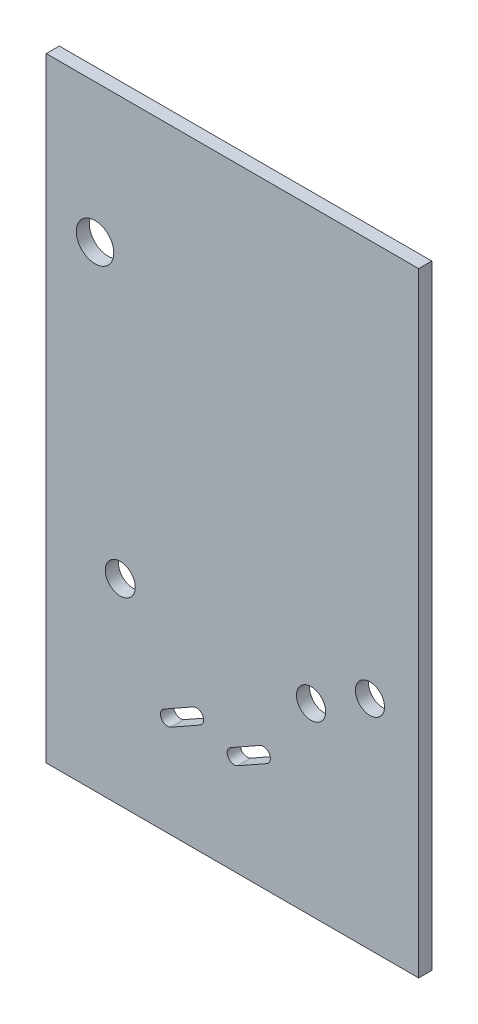
ISO-10303-21;
HEADER;
FILE_DESCRIPTION(('STEP AP214'),'2;1');
FILE_NAME('part.step','',(''),(''),'','','');
FILE_SCHEMA(('AUTOMOTIVE_DESIGN { 1 0 10303 214 1 1 1 1 }'));
ENDSEC;
DATA;
#1=APPLICATION_CONTEXT('core data for automotive mechanical design processes');
#2=APPLICATION_PROTOCOL_DEFINITION('international standard','automotive_design',2000,#1);
#3=PRODUCT_CONTEXT('',#1,'mechanical');
#4=PRODUCT('Part','Part','',(#3));
#5=PRODUCT_RELATED_PRODUCT_CATEGORY('part','',(#4));
#6=PRODUCT_DEFINITION_FORMATION('','',#4);
#7=PRODUCT_DEFINITION_CONTEXT('part definition',#1,'design');
#8=PRODUCT_DEFINITION('design','',#6,#7);
#9=PRODUCT_DEFINITION_SHAPE('','',#8);
#10=(LENGTH_UNIT() NAMED_UNIT(*) SI_UNIT(.MILLI.,.METRE.));
#11=(NAMED_UNIT(*) PLANE_ANGLE_UNIT() SI_UNIT($,.RADIAN.));
#12=(NAMED_UNIT(*) SI_UNIT($,.STERADIAN.) SOLID_ANGLE_UNIT());
#13=UNCERTAINTY_MEASURE_WITH_UNIT(LENGTH_MEASURE(1.E-05),#10,'distance_accuracy_value','');
#14=(GEOMETRIC_REPRESENTATION_CONTEXT(3) GLOBAL_UNCERTAINTY_ASSIGNED_CONTEXT((#13)) GLOBAL_UNIT_ASSIGNED_CONTEXT((#10,
#11,#12)) REPRESENTATION_CONTEXT('',''));
#15=CARTESIAN_POINT('',(0.,0.,0.));
#16=DIRECTION('',(0.,0.,1.));
#17=DIRECTION('',(1.,0.,0.));
#18=AXIS2_PLACEMENT_3D('',#15,#16,#17);
#19=CARTESIAN_POINT('',(-8.60099157288998,-45.8717455575908,3.14));
#20=DIRECTION('',(0.,0.,-1.));
#21=DIRECTION('',(-1.,0.,0.));
#22=AXIS2_PLACEMENT_3D('',#19,#20,#21);
#23=CYLINDRICAL_SURFACE('',#22,1.68807927361543);
#24=CARTESIAN_POINT('',(-8.60099157288998,-45.8717455575908,0.));
#25=DIRECTION('',(0.,0.,1.));
#26=DIRECTION('',(1.,0.,0.));
#27=AXIS2_PLACEMENT_3D('',#24,#25,#26);
#28=CIRCLE('',#27,1.68807927361543);
#29=CARTESIAN_POINT('',(-7.77339173560925,-47.343034157201,0.));
#30=VERTEX_POINT('',#29);
#31=CARTESIAN_POINT('',(-9.42859141017071,-44.4004569579806,0.));
#32=VERTEX_POINT('',#31);
#33=EDGE_CURVE('E197',#30,#32,#28,.T.);
#34=ORIENTED_EDGE('',*,*,#33,.F.);
#35=DIRECTION('',(0.,0.,-1.));
#36=VECTOR('',#35,1.);
#37=CARTESIAN_POINT('',(-7.77339173560925,-47.343034157201,3.14));
#38=LINE('',#37,#36);
#39=CARTESIAN_POINT('',(-7.77339173560925,-47.343034157201,3.14));
#40=VERTEX_POINT('',#39);
#41=EDGE_CURVE('E11',#40,#30,#38,.T.);
#42=ORIENTED_EDGE('',*,*,#41,.F.);
#43=CARTESIAN_POINT('',(-8.60099157288998,-45.8717455575908,3.14));
#44=DIRECTION('',(0.,0.,1.));
#45=DIRECTION('',(1.,0.,0.));
#46=AXIS2_PLACEMENT_3D('',#43,#44,#45);
#47=CIRCLE('',#46,1.68807927361543);
#48=CARTESIAN_POINT('',(-9.42859141017071,-44.4004569579806,3.14));
#49=VERTEX_POINT('',#48);
#50=EDGE_CURVE('E144',#40,#49,#47,.T.);
#51=ORIENTED_EDGE('',*,*,#50,.T.);
#52=DIRECTION('',(0.,0.,-1.));
#53=VECTOR('',#52,1.);
#54=CARTESIAN_POINT('',(-9.42859141017071,-44.4004569579806,3.14));
#55=LINE('',#54,#53);
#56=EDGE_CURVE('E105',#49,#32,#55,.T.);
#57=ORIENTED_EDGE('',*,*,#56,.T.);
#58=EDGE_LOOP('',(#34,#42,#51,#57));
#59=FACE_BOUND('',#58,.T.);
#60=ADVANCED_FACE('F40',(#59),#23,.F.);
#61=CARTESIAN_POINT('',(18.3612824571293,-32.6422799237855,3.14));
#62=DIRECTION('',(0.490261239632559,-0.871575537124549,0.));
#63=DIRECTION('',(0.871575537124549,0.490261239632559,0.));
#64=AXIS2_PLACEMENT_3D('',#61,#62,#63);
#65=PLANE('',#64);
#66=DIRECTION('',(-0.871575537124549,-0.490261239632559,0.));
#67=VECTOR('',#66,1.);
#68=CARTESIAN_POINT('',(18.3612824571293,-32.6422799237855,0.));
#69=LINE('',#68,#67);
#70=CARTESIAN_POINT('',(-14.7459960326056,-51.2651240742614,0.));
#71=VERTEX_POINT('',#70);
#72=EDGE_CURVE('E150',#30,#71,#69,.T.);
#73=ORIENTED_EDGE('',*,*,#72,.T.);
#74=DIRECTION('',(0.,0.,-1.));
#75=VECTOR('',#74,1.);
#76=CARTESIAN_POINT('',(-14.7459960326056,-51.2651240742614,3.14));
#77=LINE('',#76,#75);
#78=CARTESIAN_POINT('',(-14.7459960326056,-51.2651240742614,3.14));
#79=VERTEX_POINT('',#78);
#80=EDGE_CURVE('E50',#79,#71,#77,.T.);
#81=ORIENTED_EDGE('',*,*,#80,.F.);
#82=DIRECTION('',(-0.871575537124549,-0.490261239632559,0.));
#83=VECTOR('',#82,1.);
#84=CARTESIAN_POINT('',(18.3612824571293,-32.6422799237855,3.14));
#85=LINE('',#84,#83);
#86=EDGE_CURVE('E138',#40,#79,#85,.T.);
#87=ORIENTED_EDGE('',*,*,#86,.F.);
#88=ORIENTED_EDGE('',*,*,#41,.T.);
#89=EDGE_LOOP('',(#73,#81,#87,#88));
#90=FACE_BOUND('',#89,.T.);
#91=ADVANCED_FACE('F148',(#90),#65,.F.);
#92=CARTESIAN_POINT('',(-15.5735958698864,-49.7938354746512,3.14));
#93=DIRECTION('',(0.,0.,-1.));
#94=DIRECTION('',(-1.,0.,0.));
#95=AXIS2_PLACEMENT_3D('',#92,#93,#94);
#96=CYLINDRICAL_SURFACE('',#95,1.68807927361543);
#97=CARTESIAN_POINT('',(-15.5735958698864,-49.7938354746512,0.));
#98=DIRECTION('',(0.,0.,1.));
#99=DIRECTION('',(1.,0.,0.));
#100=AXIS2_PLACEMENT_3D('',#97,#98,#99);
#101=CIRCLE('',#100,1.68807927361543);
#102=CARTESIAN_POINT('',(-16.4011957071671,-48.322546875041,0.));
#103=VERTEX_POINT('',#102);
#104=EDGE_CURVE('E201',#103,#71,#101,.T.);
#105=ORIENTED_EDGE('',*,*,#104,.F.);
#106=DIRECTION('',(0.,0.,-1.));
#107=VECTOR('',#106,1.);
#108=CARTESIAN_POINT('',(-16.4011957071671,-48.322546875041,3.14));
#109=LINE('',#108,#107);
#110=CARTESIAN_POINT('',(-16.4011957071671,-48.322546875041,3.14));
#111=VERTEX_POINT('',#110);
#112=EDGE_CURVE('E98',#111,#103,#109,.T.);
#113=ORIENTED_EDGE('',*,*,#112,.F.);
#114=CARTESIAN_POINT('',(-15.5735958698864,-49.7938354746512,3.14));
#115=DIRECTION('',(0.,0.,1.));
#116=DIRECTION('',(1.,0.,0.));
#117=AXIS2_PLACEMENT_3D('',#114,#115,#116);
#118=CIRCLE('',#117,1.68807927361543);
#119=EDGE_CURVE('E143',#111,#79,#118,.T.);
#120=ORIENTED_EDGE('',*,*,#119,.T.);
#121=ORIENTED_EDGE('',*,*,#80,.T.);
#122=EDGE_LOOP('',(#105,#113,#120,#121));
#123=FACE_BOUND('',#122,.T.);
#124=ADVANCED_FACE('F155',(#123),#96,.F.);
#125=CARTESIAN_POINT('',(0.426404130113626,-49.7938354746512,3.14));
#126=DIRECTION('',(0.,0.,-1.));
#127=DIRECTION('',(-1.,0.,0.));
#128=AXIS2_PLACEMENT_3D('',#125,#126,#127);
#129=CYLINDRICAL_SURFACE('',#128,1.68807927361543);
#130=CARTESIAN_POINT('',(0.426404130113626,-49.7938354746512,0.));
#131=DIRECTION('',(0.,0.,1.));
#132=DIRECTION('',(1.,0.,0.));
#133=AXIS2_PLACEMENT_3D('',#130,#131,#132);
#134=CIRCLE('',#133,1.68807927361543);
#135=CARTESIAN_POINT('',(-0.401195707167103,-48.322546875041,0.));
#136=VERTEX_POINT('',#135);
#137=CARTESIAN_POINT('',(1.25400396739436,-51.2651240742614,0.));
#138=VERTEX_POINT('',#137);
#139=EDGE_CURVE('E179',#136,#138,#134,.T.);
#140=ORIENTED_EDGE('',*,*,#139,.F.);
#141=DIRECTION('',(0.,0.,-1.));
#142=VECTOR('',#141,1.);
#143=CARTESIAN_POINT('',(-0.401195707167103,-48.322546875041,3.14));
#144=LINE('',#143,#142);
#145=CARTESIAN_POINT('',(-0.401195707167103,-48.322546875041,3.14));
#146=VERTEX_POINT('',#145);
#147=EDGE_CURVE('E210',#146,#136,#144,.T.);
#148=ORIENTED_EDGE('',*,*,#147,.F.);
#149=CARTESIAN_POINT('',(0.426404130113626,-49.7938354746512,3.14));
#150=DIRECTION('',(0.,0.,1.));
#151=DIRECTION('',(1.,0.,0.));
#152=AXIS2_PLACEMENT_3D('',#149,#150,#151);
#153=CIRCLE('',#152,1.68807927361543);
#154=CARTESIAN_POINT('',(1.25400396739436,-51.2651240742614,3.14));
#155=VERTEX_POINT('',#154);
#156=EDGE_CURVE('E249',#146,#155,#153,.T.);
#157=ORIENTED_EDGE('',*,*,#156,.T.);
#158=DIRECTION('',(0.,0.,-1.));
#159=VECTOR('',#158,1.);
#160=CARTESIAN_POINT('',(1.25400396739436,-51.2651240742614,3.14));
#161=LINE('',#160,#159);
#162=EDGE_CURVE('E212',#155,#138,#161,.T.);
#163=ORIENTED_EDGE('',*,*,#162,.T.);
#164=EDGE_LOOP('',(#140,#148,#157,#163));
#165=FACE_BOUND('',#164,.T.);
#166=ADVANCED_FACE('F305',(#165),#129,.F.);
#167=CARTESIAN_POINT('',(20.5517801119447,-36.5364979767907,3.14));
#168=DIRECTION('',(-0.490261239632559,0.871575537124549,0.));
#169=DIRECTION('',(-0.871575537124549,-0.490261239632559,0.));
#170=AXIS2_PLACEMENT_3D('',#167,#168,#169);
#171=PLANE('',#170);
#172=DIRECTION('',(0.871575537124549,0.490261239632559,0.));
#173=VECTOR('',#172,1.);
#174=CARTESIAN_POINT('',(20.5517801119447,-36.5364979767907,0.));
#175=LINE('',#174,#173);
#176=CARTESIAN_POINT('',(6.57140858982929,-44.4004569579806,0.));
#177=VERTEX_POINT('',#176);
#178=EDGE_CURVE('E182',#136,#177,#175,.T.);
#179=ORIENTED_EDGE('',*,*,#178,.T.);
#180=DIRECTION('',(0.,0.,-1.));
#181=VECTOR('',#180,1.);
#182=CARTESIAN_POINT('',(6.57140858982929,-44.4004569579806,3.14));
#183=LINE('',#182,#181);
#184=CARTESIAN_POINT('',(6.57140858982929,-44.4004569579806,3.14));
#185=VERTEX_POINT('',#184);
#186=EDGE_CURVE('E216',#185,#177,#183,.T.);
#187=ORIENTED_EDGE('',*,*,#186,.F.);
#188=DIRECTION('',(0.871575537124549,0.490261239632559,0.));
#189=VECTOR('',#188,1.);
#190=CARTESIAN_POINT('',(20.5517801119447,-36.5364979767907,3.14));
#191=LINE('',#190,#189);
#192=EDGE_CURVE('E255',#146,#185,#191,.T.);
#193=ORIENTED_EDGE('',*,*,#192,.F.);
#194=ORIENTED_EDGE('',*,*,#147,.T.);
#195=EDGE_LOOP('',(#179,#187,#193,#194));
#196=FACE_BOUND('',#195,.T.);
#197=ADVANCED_FACE('F301',(#196),#171,.F.);
#198=CARTESIAN_POINT('',(7.39900842711002,-45.8717455575908,3.14));
#199=DIRECTION('',(0.,0.,-1.));
#200=DIRECTION('',(-1.,0.,0.));
#201=AXIS2_PLACEMENT_3D('',#198,#199,#200);
#202=CYLINDRICAL_SURFACE('',#201,1.68807927361543);
#203=CARTESIAN_POINT('',(7.39900842711002,-45.8717455575908,0.));
#204=DIRECTION('',(0.,0.,1.));
#205=DIRECTION('',(1.,0.,0.));
#206=AXIS2_PLACEMENT_3D('',#203,#204,#205);
#207=CIRCLE('',#206,1.68807927361543);
#208=CARTESIAN_POINT('',(8.22660826439075,-47.343034157201,0.));
#209=VERTEX_POINT('',#208);
#210=EDGE_CURVE('E185',#209,#177,#207,.T.);
#211=ORIENTED_EDGE('',*,*,#210,.F.);
#212=DIRECTION('',(0.,0.,-1.));
#213=VECTOR('',#212,1.);
#214=CARTESIAN_POINT('',(8.22660826439075,-47.343034157201,3.14));
#215=LINE('',#214,#213);
#216=CARTESIAN_POINT('',(8.22660826439075,-47.343034157201,3.14));
#217=VERTEX_POINT('',#216);
#218=EDGE_CURVE('E214',#217,#209,#215,.T.);
#219=ORIENTED_EDGE('',*,*,#218,.F.);
#220=CARTESIAN_POINT('',(7.39900842711002,-45.8717455575908,3.14));
#221=DIRECTION('',(0.,0.,1.));
#222=DIRECTION('',(1.,0.,0.));
#223=AXIS2_PLACEMENT_3D('',#220,#221,#222);
#224=CIRCLE('',#223,1.68807927361543);
#225=EDGE_CURVE('E257',#217,#185,#224,.T.);
#226=ORIENTED_EDGE('',*,*,#225,.T.);
#227=ORIENTED_EDGE('',*,*,#186,.T.);
#228=EDGE_LOOP('',(#211,#219,#226,#227));
#229=FACE_BOUND('',#228,.T.);
#230=ADVANCED_FACE('F298',(#229),#202,.F.);
#231=CARTESIAN_POINT('',(0.,-73.6471361532433,3.14));
#232=DIRECTION('',(0.,-1.,0.));
#233=DIRECTION('',(0.,0.,-1.));
#234=AXIS2_PLACEMENT_3D('',#231,#232,#233);
#235=PLANE('',#234);
#236=DIRECTION('',(-1.,0.,0.));
#237=VECTOR('',#236,1.);
#238=CARTESIAN_POINT('',(0.,-73.6471361532433,0.));
#239=LINE('',#238,#237);
#240=CARTESIAN_POINT('',(44.6471361532433,-73.6471361532433,0.));
#241=VERTEX_POINT('',#240);
#242=CARTESIAN_POINT('',(-44.6471361532433,-73.6471361532433,0.));
#243=VERTEX_POINT('',#242);
#244=EDGE_CURVE('E164',#241,#243,#239,.T.);
#245=ORIENTED_EDGE('',*,*,#244,.F.);
#246=DIRECTION('',(0.,0.,-1.));
#247=VECTOR('',#246,1.);
#248=CARTESIAN_POINT('',(44.6471361532433,-73.6471361532433,3.14));
#249=LINE('',#248,#247);
#250=CARTESIAN_POINT('',(44.6471361532433,-73.6471361532433,3.14));
#251=VERTEX_POINT('',#250);
#252=EDGE_CURVE('E44',#251,#241,#249,.T.);
#253=ORIENTED_EDGE('',*,*,#252,.F.);
#254=DIRECTION('',(-1.,0.,0.));
#255=VECTOR('',#254,1.);
#256=CARTESIAN_POINT('',(0.,-73.6471361532433,3.14));
#257=LINE('',#256,#255);
#258=CARTESIAN_POINT('',(-44.6471361532433,-73.6471361532433,3.14));
#259=VERTEX_POINT('',#258);
#260=EDGE_CURVE('E208',#251,#259,#257,.T.);
#261=ORIENTED_EDGE('',*,*,#260,.T.);
#262=DIRECTION('',(0.,0.,-1.));
#263=VECTOR('',#262,1.);
#264=CARTESIAN_POINT('',(-44.6471361532433,-73.6471361532433,3.14));
#265=LINE('',#264,#263);
#266=EDGE_CURVE('E163',#259,#243,#265,.T.);
#267=ORIENTED_EDGE('',*,*,#266,.T.);
#268=EDGE_LOOP('',(#245,#253,#261,#267));
#269=FACE_BOUND('',#268,.T.);
#270=ADVANCED_FACE('F42',(#269),#235,.T.);
#271=CARTESIAN_POINT('',(44.6471361532433,0.,3.14));
#272=DIRECTION('',(1.,0.,0.));
#273=DIRECTION('',(0.,0.,-1.));
#274=AXIS2_PLACEMENT_3D('',#271,#272,#273);
#275=PLANE('',#274);
#276=DIRECTION('',(0.,-1.,0.));
#277=VECTOR('',#276,1.);
#278=CARTESIAN_POINT('',(44.6471361532433,0.,0.));
#279=LINE('',#278,#277);
#280=CARTESIAN_POINT('',(44.6471361532433,73.6471361532433,0.));
#281=VERTEX_POINT('',#280);
#282=EDGE_CURVE('E167',#281,#241,#279,.T.);
#283=ORIENTED_EDGE('',*,*,#282,.F.);
#284=DIRECTION('',(0.,0.,-1.));
#285=VECTOR('',#284,1.);
#286=CARTESIAN_POINT('',(44.6471361532433,73.6471361532433,3.14));
#287=LINE('',#286,#285);
#288=CARTESIAN_POINT('',(44.6471361532433,73.6471361532433,3.14));
#289=VERTEX_POINT('',#288);
#290=EDGE_CURVE('E221',#289,#281,#287,.T.);
#291=ORIENTED_EDGE('',*,*,#290,.F.);
#292=DIRECTION('',(0.,-1.,0.));
#293=VECTOR('',#292,1.);
#294=CARTESIAN_POINT('',(44.6471361532433,0.,3.14));
#295=LINE('',#294,#293);
#296=EDGE_CURVE('E230',#289,#251,#295,.T.);
#297=ORIENTED_EDGE('',*,*,#296,.T.);
#298=ORIENTED_EDGE('',*,*,#252,.T.);
#299=EDGE_LOOP('',(#283,#291,#297,#298));
#300=FACE_BOUND('',#299,.T.);
#301=ADVANCED_FACE('F228',(#300),#275,.T.);
#302=CARTESIAN_POINT('',(0.,73.6471361532433,3.14));
#303=DIRECTION('',(0.,1.,0.));
#304=DIRECTION('',(0.,0.,1.));
#305=AXIS2_PLACEMENT_3D('',#302,#303,#304);
#306=PLANE('',#305);
#307=DIRECTION('',(1.,0.,0.));
#308=VECTOR('',#307,1.);
#309=CARTESIAN_POINT('',(0.,73.6471361532433,0.));
#310=LINE('',#309,#308);
#311=CARTESIAN_POINT('',(-44.6471361532433,73.6471361532433,0.));
#312=VERTEX_POINT('',#311);
#313=EDGE_CURVE('E170',#312,#281,#310,.T.);
#314=ORIENTED_EDGE('',*,*,#313,.F.);
#315=DIRECTION('',(0.,0.,-1.));
#316=VECTOR('',#315,1.);
#317=CARTESIAN_POINT('',(-44.6471361532433,73.6471361532433,3.14));
#318=LINE('',#317,#316);
#319=CARTESIAN_POINT('',(-44.6471361532433,73.6471361532433,3.14));
#320=VERTEX_POINT('',#319);
#321=EDGE_CURVE('E220',#320,#312,#318,.T.);
#322=ORIENTED_EDGE('',*,*,#321,.F.);
#323=DIRECTION('',(1.,0.,0.));
#324=VECTOR('',#323,1.);
#325=CARTESIAN_POINT('',(0.,73.6471361532433,3.14));
#326=LINE('',#325,#324);
#327=EDGE_CURVE('E237',#320,#289,#326,.T.);
#328=ORIENTED_EDGE('',*,*,#327,.T.);
#329=ORIENTED_EDGE('',*,*,#290,.T.);
#330=EDGE_LOOP('',(#314,#322,#328,#329));
#331=FACE_BOUND('',#330,.T.);
#332=ADVANCED_FACE('F235',(#331),#306,.T.);
#333=CARTESIAN_POINT('',(16.7060827825679,-29.6997027245651,3.14));
#334=DIRECTION('',(-0.490261239632559,0.871575537124549,0.));
#335=DIRECTION('',(-0.871575537124549,-0.490261239632559,0.));
#336=AXIS2_PLACEMENT_3D('',#333,#334,#335);
#337=PLANE('',#336);
#338=DIRECTION('',(0.871575537124549,0.490261239632559,0.));
#339=VECTOR('',#338,1.);
#340=CARTESIAN_POINT('',(16.7060827825679,-29.6997027245651,0.));
#341=LINE('',#340,#339);
#342=EDGE_CURVE('E203',#103,#32,#341,.T.);
#343=ORIENTED_EDGE('',*,*,#342,.T.);
#344=ORIENTED_EDGE('',*,*,#56,.F.);
#345=DIRECTION('',(0.871575537124549,0.490261239632559,0.));
#346=VECTOR('',#345,1.);
#347=CARTESIAN_POINT('',(16.7060827825679,-29.6997027245651,3.14));
#348=LINE('',#347,#346);
#349=EDGE_CURVE('E59',#111,#49,#348,.T.);
#350=ORIENTED_EDGE('',*,*,#349,.F.);
#351=ORIENTED_EDGE('',*,*,#112,.T.);
#352=EDGE_LOOP('',(#343,#344,#350,#351));
#353=FACE_BOUND('',#352,.T.);
#354=ADVANCED_FACE('F269',(#353),#337,.F.);
#355=CARTESIAN_POINT('',(18.8494942682823,-29.546234455101,3.14));
#356=DIRECTION('',(0.,0.,-1.));
#357=DIRECTION('',(-1.,0.,0.));
#358=AXIS2_PLACEMENT_3D('',#355,#356,#357);
#359=CYLINDRICAL_SURFACE('',#358,3.5);
#360=CARTESIAN_POINT('',(18.8494942682823,-29.546234455101,3.14));
#361=DIRECTION('',(0.,0.,1.));
#362=DIRECTION('',(1.,0.,0.));
#363=AXIS2_PLACEMENT_3D('',#360,#361,#362);
#364=CIRCLE('',#363,3.5);
#365=CARTESIAN_POINT('',(22.3494942682823,-29.546234455101,3.14));
#366=VERTEX_POINT('',#365);
#367=EDGE_CURVE('E265',#366,#366,#364,.T.);
#368=ORIENTED_EDGE('',*,*,#367,.T.);
#369=EDGE_LOOP('',(#368));
#370=FACE_BOUND('',#369,.T.);
#371=CARTESIAN_POINT('',(18.8494942682823,-29.546234455101,0.));
#372=DIRECTION('',(0.,0.,1.));
#373=DIRECTION('',(1.,0.,0.));
#374=AXIS2_PLACEMENT_3D('',#371,#372,#373);
#375=CIRCLE('',#374,3.5);
#376=CARTESIAN_POINT('',(22.3494942682823,-29.546234455101,0.));
#377=VERTEX_POINT('',#376);
#378=EDGE_CURVE('E194',#377,#377,#375,.T.);
#379=ORIENTED_EDGE('',*,*,#378,.F.);
#380=EDGE_LOOP('',(#379));
#381=FACE_BOUND('',#380,.T.);
#382=ADVANCED_FACE('F271',(#370,#381),#359,.F.);
#383=CARTESIAN_POINT('',(32.9602390001932,-21.4766523115394,3.14));
#384=DIRECTION('',(0.,0.,-1.));
#385=DIRECTION('',(-1.,0.,0.));
#386=AXIS2_PLACEMENT_3D('',#383,#384,#385);
#387=CYLINDRICAL_SURFACE('',#386,3.5);
#388=CARTESIAN_POINT('',(32.9602390001932,-21.4766523115394,3.14));
#389=DIRECTION('',(0.,0.,1.));
#390=DIRECTION('',(1.,0.,0.));
#391=AXIS2_PLACEMENT_3D('',#388,#389,#390);
#392=CIRCLE('',#391,3.5);
#393=CARTESIAN_POINT('',(36.4602390001932,-21.4766523115394,3.14));
#394=VERTEX_POINT('',#393);
#395=EDGE_CURVE('E262',#394,#394,#392,.T.);
#396=ORIENTED_EDGE('',*,*,#395,.T.);
#397=EDGE_LOOP('',(#396));
#398=FACE_BOUND('',#397,.T.);
#399=CARTESIAN_POINT('',(32.9602390001932,-21.4766523115394,0.));
#400=DIRECTION('',(0.,0.,1.));
#401=DIRECTION('',(1.,0.,0.));
#402=AXIS2_PLACEMENT_3D('',#399,#400,#401);
#403=CIRCLE('',#402,3.5);
#404=CARTESIAN_POINT('',(36.4602390001932,-21.4766523115394,0.));
#405=VERTEX_POINT('',#404);
#406=EDGE_CURVE('E191',#405,#405,#403,.T.);
#407=ORIENTED_EDGE('',*,*,#406,.F.);
#408=EDGE_LOOP('',(#407));
#409=FACE_BOUND('',#408,.T.);
#410=ADVANCED_FACE('F277',(#398,#409),#387,.F.);
#411=CARTESIAN_POINT('',(22.2069797865062,-39.479075176011,3.14));
#412=DIRECTION('',(0.490261239632559,-0.871575537124549,0.));
#413=DIRECTION('',(0.871575537124549,0.490261239632559,0.));
#414=AXIS2_PLACEMENT_3D('',#411,#412,#413);
#415=PLANE('',#414);
#416=DIRECTION('',(-0.871575537124549,-0.490261239632559,0.));
#417=VECTOR('',#416,1.);
#418=CARTESIAN_POINT('',(22.2069797865062,-39.479075176011,0.));
#419=LINE('',#418,#417);
#420=EDGE_CURVE('E188',#209,#138,#419,.T.);
#421=ORIENTED_EDGE('',*,*,#420,.T.);
#422=ORIENTED_EDGE('',*,*,#162,.F.);
#423=DIRECTION('',(-0.871575537124549,-0.490261239632559,0.));
#424=VECTOR('',#423,1.);
#425=CARTESIAN_POINT('',(22.2069797865062,-39.479075176011,3.14));
#426=LINE('',#425,#424);
#427=EDGE_CURVE('E260',#217,#155,#426,.T.);
#428=ORIENTED_EDGE('',*,*,#427,.F.);
#429=ORIENTED_EDGE('',*,*,#218,.T.);
#430=EDGE_LOOP('',(#421,#422,#428,#429));
#431=FACE_BOUND('',#430,.T.);
#432=ADVANCED_FACE('F292',(#431),#415,.F.);
#433=CARTESIAN_POINT('',(-32.9539321976683,40.3410634247451,3.14));
#434=DIRECTION('',(0.,0.,-1.));
#435=DIRECTION('',(-1.,0.,0.));
#436=AXIS2_PLACEMENT_3D('',#433,#434,#435);
#437=CYLINDRICAL_SURFACE('',#436,4.5);
#438=CARTESIAN_POINT('',(-32.9539321976683,40.3410634247451,3.14));
#439=DIRECTION('',(0.,0.,1.));
#440=DIRECTION('',(1.,0.,0.));
#441=AXIS2_PLACEMENT_3D('',#438,#439,#440);
#442=CIRCLE('',#441,4.5);
#443=CARTESIAN_POINT('',(-28.4539321976683,40.3410634247451,3.14));
#444=VERTEX_POINT('',#443);
#445=EDGE_CURVE('E246',#444,#444,#442,.T.);
#446=ORIENTED_EDGE('',*,*,#445,.T.);
#447=EDGE_LOOP('',(#446));
#448=FACE_BOUND('',#447,.T.);
#449=CARTESIAN_POINT('',(-32.9539321976683,40.3410634247451,0.));
#450=DIRECTION('',(0.,0.,1.));
#451=DIRECTION('',(1.,0.,0.));
#452=AXIS2_PLACEMENT_3D('',#449,#450,#451);
#453=CIRCLE('',#452,4.5);
#454=CARTESIAN_POINT('',(-28.4539321976683,40.3410634247451,0.));
#455=VERTEX_POINT('',#454);
#456=EDGE_CURVE('E176',#455,#455,#453,.T.);
#457=ORIENTED_EDGE('',*,*,#456,.F.);
#458=EDGE_LOOP('',(#457));
#459=FACE_BOUND('',#458,.T.);
#460=ADVANCED_FACE('F296',(#448,#459),#437,.F.);
#461=CARTESIAN_POINT('',(-44.6471361532433,0.,3.14));
#462=DIRECTION('',(-1.,0.,0.));
#463=DIRECTION('',(0.,0.,1.));
#464=AXIS2_PLACEMENT_3D('',#461,#462,#463);
#465=PLANE('',#464);
#466=DIRECTION('',(0.,1.,0.));
#467=VECTOR('',#466,1.);
#468=CARTESIAN_POINT('',(-44.6471361532433,0.,0.));
#469=LINE('',#468,#467);
#470=EDGE_CURVE('E173',#243,#312,#469,.T.);
#471=ORIENTED_EDGE('',*,*,#470,.F.);
#472=ORIENTED_EDGE('',*,*,#266,.F.);
#473=DIRECTION('',(0.,1.,0.));
#474=VECTOR('',#473,1.);
#475=CARTESIAN_POINT('',(-44.6471361532433,0.,3.14));
#476=LINE('',#475,#474);
#477=EDGE_CURVE('E243',#259,#320,#476,.T.);
#478=ORIENTED_EDGE('',*,*,#477,.T.);
#479=ORIENTED_EDGE('',*,*,#321,.T.);
#480=EDGE_LOOP('',(#471,#472,#478,#479));
#481=FACE_BOUND('',#480,.T.);
#482=ADVANCED_FACE('F245',(#481),#465,.T.);
#483=CARTESIAN_POINT('',(-26.9008312163464,-26.5172025656939,3.14));
#484=DIRECTION('',(0.,0.,-1.));
#485=DIRECTION('',(-1.,0.,0.));
#486=AXIS2_PLACEMENT_3D('',#483,#484,#485);
#487=CYLINDRICAL_SURFACE('',#486,3.6);
#488=CARTESIAN_POINT('',(-26.9008312163464,-26.5172025656939,3.14));
#489=DIRECTION('',(0.,0.,1.));
#490=DIRECTION('',(1.,0.,0.));
#491=AXIS2_PLACEMENT_3D('',#488,#489,#490);
#492=CIRCLE('',#491,3.6);
#493=CARTESIAN_POINT('',(-23.3008312163464,-26.5172025656939,3.14));
#494=VERTEX_POINT('',#493);
#495=EDGE_CURVE('E157',#494,#494,#492,.T.);
#496=ORIENTED_EDGE('',*,*,#495,.T.);
#497=EDGE_LOOP('',(#496));
#498=FACE_BOUND('',#497,.T.);
#499=CARTESIAN_POINT('',(-26.9008312163464,-26.5172025656939,0.));
#500=DIRECTION('',(0.,0.,1.));
#501=DIRECTION('',(1.,0.,0.));
#502=AXIS2_PLACEMENT_3D('',#499,#500,#501);
#503=CIRCLE('',#502,3.6);
#504=CARTESIAN_POINT('',(-23.3008312163464,-26.5172025656939,0.));
#505=VERTEX_POINT('',#504);
#506=EDGE_CURVE('E205',#505,#505,#503,.T.);
#507=ORIENTED_EDGE('',*,*,#506,.F.);
#508=EDGE_LOOP('',(#507));
#509=FACE_BOUND('',#508,.T.);
#510=ADVANCED_FACE('F314',(#498,#509),#487,.F.);
#511=CARTESIAN_POINT('',(0.,0.,3.14));
#512=DIRECTION('',(0.,0.,1.));
#513=DIRECTION('',(1.,0.,0.));
#514=AXIS2_PLACEMENT_3D('',#511,#512,#513);
#515=PLANE('',#514);
#516=ORIENTED_EDGE('',*,*,#260,.F.);
#517=ORIENTED_EDGE('',*,*,#296,.F.);
#518=ORIENTED_EDGE('',*,*,#327,.F.);
#519=ORIENTED_EDGE('',*,*,#477,.F.);
#520=EDGE_LOOP('',(#516,#517,#518,#519));
#521=FACE_BOUND('',#520,.T.);
#522=ORIENTED_EDGE('',*,*,#445,.F.);
#523=EDGE_LOOP('',(#522));
#524=FACE_BOUND('',#523,.T.);
#525=ORIENTED_EDGE('',*,*,#156,.F.);
#526=ORIENTED_EDGE('',*,*,#192,.T.);
#527=ORIENTED_EDGE('',*,*,#225,.F.);
#528=ORIENTED_EDGE('',*,*,#427,.T.);
#529=EDGE_LOOP('',(#525,#526,#527,#528));
#530=FACE_BOUND('',#529,.T.);
#531=ORIENTED_EDGE('',*,*,#395,.F.);
#532=EDGE_LOOP('',(#531));
#533=FACE_BOUND('',#532,.T.);
#534=ORIENTED_EDGE('',*,*,#367,.F.);
#535=EDGE_LOOP('',(#534));
#536=FACE_BOUND('',#535,.T.);
#537=ORIENTED_EDGE('',*,*,#50,.F.);
#538=ORIENTED_EDGE('',*,*,#86,.T.);
#539=ORIENTED_EDGE('',*,*,#119,.F.);
#540=ORIENTED_EDGE('',*,*,#349,.T.);
#541=EDGE_LOOP('',(#537,#538,#539,#540));
#542=FACE_BOUND('',#541,.T.);
#543=ORIENTED_EDGE('',*,*,#495,.F.);
#544=EDGE_LOOP('',(#543));
#545=FACE_BOUND('',#544,.T.);
#546=ADVANCED_FACE('F140',(#521,#524,#530,#533,#536,#542,#545),#515,.T.);
#547=CARTESIAN_POINT('',(0.,0.,0.));
#548=DIRECTION('',(0.,0.,1.));
#549=DIRECTION('',(1.,0.,0.));
#550=AXIS2_PLACEMENT_3D('',#547,#548,#549);
#551=PLANE('',#550);
#552=ORIENTED_EDGE('',*,*,#244,.T.);
#553=ORIENTED_EDGE('',*,*,#470,.T.);
#554=ORIENTED_EDGE('',*,*,#313,.T.);
#555=ORIENTED_EDGE('',*,*,#282,.T.);
#556=EDGE_LOOP('',(#552,#553,#554,#555));
#557=FACE_BOUND('',#556,.T.);
#558=ORIENTED_EDGE('',*,*,#456,.T.);
#559=EDGE_LOOP('',(#558));
#560=FACE_BOUND('',#559,.T.);
#561=ORIENTED_EDGE('',*,*,#139,.T.);
#562=ORIENTED_EDGE('',*,*,#420,.F.);
#563=ORIENTED_EDGE('',*,*,#210,.T.);
#564=ORIENTED_EDGE('',*,*,#178,.F.);
#565=EDGE_LOOP('',(#561,#562,#563,#564));
#566=FACE_BOUND('',#565,.T.);
#567=ORIENTED_EDGE('',*,*,#406,.T.);
#568=EDGE_LOOP('',(#567));
#569=FACE_BOUND('',#568,.T.);
#570=ORIENTED_EDGE('',*,*,#378,.T.);
#571=EDGE_LOOP('',(#570));
#572=FACE_BOUND('',#571,.T.);
#573=ORIENTED_EDGE('',*,*,#33,.T.);
#574=ORIENTED_EDGE('',*,*,#342,.F.);
#575=ORIENTED_EDGE('',*,*,#104,.T.);
#576=ORIENTED_EDGE('',*,*,#72,.F.);
#577=EDGE_LOOP('',(#573,#574,#575,#576));
#578=FACE_BOUND('',#577,.T.);
#579=ORIENTED_EDGE('',*,*,#506,.T.);
#580=EDGE_LOOP('',(#579));
#581=FACE_BOUND('',#580,.T.);
#582=ADVANCED_FACE('F233',(#557,#560,#566,#569,#572,#578,#581),#551,.F.);
#583=CLOSED_SHELL('',(#60,#91,#124,#166,#197,#230,#270,#301,#332,#354,#382,#410,#432,#460,#482,
#510,#546,#582));
#584=MANIFOLD_SOLID_BREP('B2',#583);
#585=ADVANCED_BREP_SHAPE_REPRESENTATION('',(#18,#584),#14);
#586=SHAPE_DEFINITION_REPRESENTATION(#9,#585);
ENDSEC;
END-ISO-10303-21;
